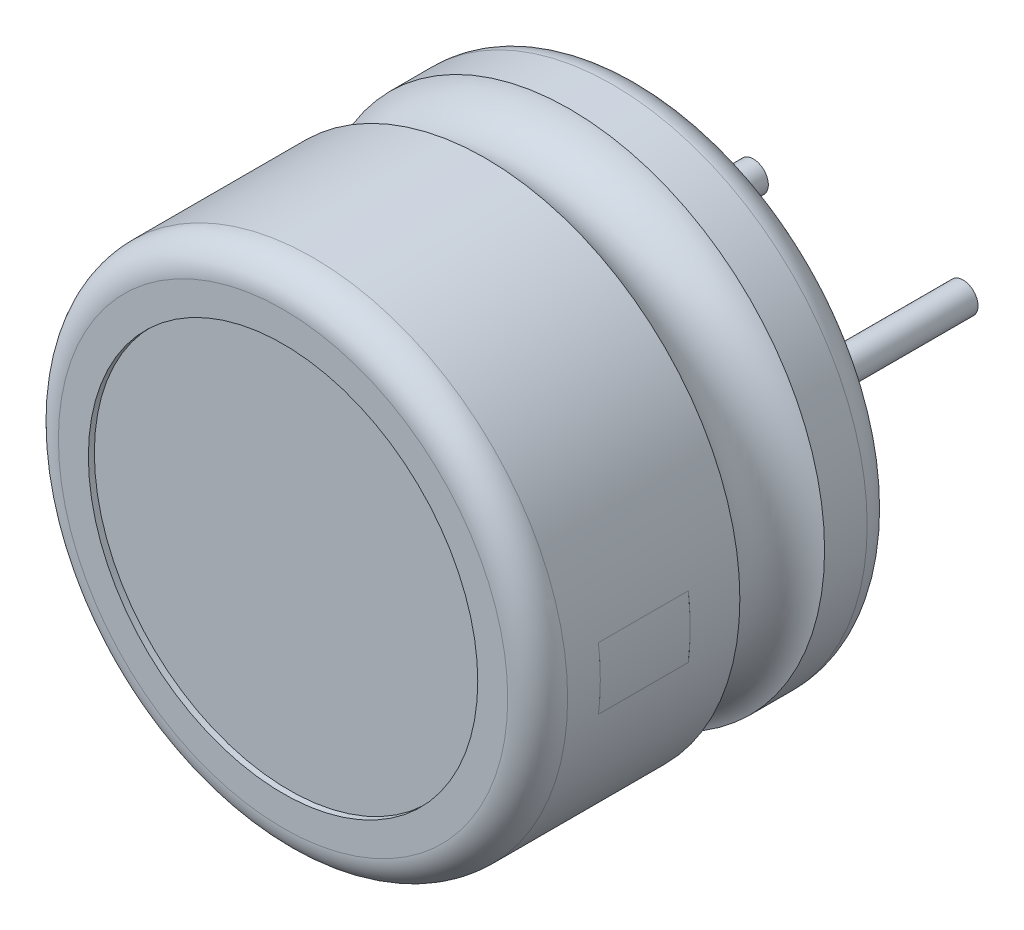
ISO-10303-21;
HEADER;
FILE_DESCRIPTION(('STEP AP214'),'2;1');
FILE_NAME('part.step','',(''),(''),'','','');
FILE_SCHEMA(('AUTOMOTIVE_DESIGN { 1 0 10303 214 1 1 1 1 }'));
ENDSEC;
DATA;
#1=APPLICATION_CONTEXT('core data for automotive mechanical design processes');
#2=APPLICATION_PROTOCOL_DEFINITION('international standard','automotive_design',2000,#1);
#3=PRODUCT_CONTEXT('',#1,'mechanical');
#4=PRODUCT('Part','Part','',(#3));
#5=PRODUCT_RELATED_PRODUCT_CATEGORY('part','',(#4));
#6=PRODUCT_DEFINITION_FORMATION('','',#4);
#7=PRODUCT_DEFINITION_CONTEXT('part definition',#1,'design');
#8=PRODUCT_DEFINITION('design','',#6,#7);
#9=PRODUCT_DEFINITION_SHAPE('','',#8);
#10=(LENGTH_UNIT() NAMED_UNIT(*) SI_UNIT(.MILLI.,.METRE.));
#11=(NAMED_UNIT(*) PLANE_ANGLE_UNIT() SI_UNIT($,.RADIAN.));
#12=(NAMED_UNIT(*) SI_UNIT($,.STERADIAN.) SOLID_ANGLE_UNIT());
#13=UNCERTAINTY_MEASURE_WITH_UNIT(LENGTH_MEASURE(1.E-05),#10,'distance_accuracy_value','');
#14=(GEOMETRIC_REPRESENTATION_CONTEXT(3) GLOBAL_UNCERTAINTY_ASSIGNED_CONTEXT((#13)) GLOBAL_UNIT_ASSIGNED_CONTEXT((#10,
#11,#12)) REPRESENTATION_CONTEXT('',''));
#15=CARTESIAN_POINT('',(0.,0.,0.));
#16=DIRECTION('',(0.,0.,1.));
#17=DIRECTION('',(1.,0.,0.));
#18=AXIS2_PLACEMENT_3D('',#15,#16,#17);
#19=CARTESIAN_POINT('',(0.,0.,0.2));
#20=DIRECTION('',(0.,0.,1.));
#21=DIRECTION('',(1.,0.,0.));
#22=AXIS2_PLACEMENT_3D('',#19,#20,#21);
#23=PLANE('',#22);
#24=CARTESIAN_POINT('',(0.,0.,0.2));
#25=DIRECTION('',(0.,0.,1.));
#26=DIRECTION('',(1.,0.,0.));
#27=AXIS2_PLACEMENT_3D('',#24,#25,#26);
#28=CIRCLE('',#27,3.25);
#29=CARTESIAN_POINT('',(3.25,0.,0.2));
#30=VERTEX_POINT('',#29);
#31=EDGE_CURVE('P0_E161',#30,#30,#28,.F.);
#32=ORIENTED_EDGE('',*,*,#31,.T.);
#33=EDGE_LOOP('',(#32));
#34=FACE_BOUND('',#33,.T.);
#35=ADVANCED_FACE('P0_F24',(#34),#23,.F.);
#36=CARTESIAN_POINT('',(0.,0.,0.));
#37=DIRECTION('',(0.,0.,1.));
#38=DIRECTION('',(1.,0.,0.));
#39=AXIS2_PLACEMENT_3D('',#36,#37,#38);
#40=CYLINDRICAL_SURFACE('',#39,3.25);
#41=ORIENTED_EDGE('',*,*,#31,.F.);
#42=EDGE_LOOP('',(#41));
#43=FACE_BOUND('',#42,.T.);
#44=CARTESIAN_POINT('',(0.,0.,0.));
#45=DIRECTION('',(0.,0.,1.));
#46=DIRECTION('',(1.,0.,0.));
#47=AXIS2_PLACEMENT_3D('',#44,#45,#46);
#48=CIRCLE('',#47,3.25);
#49=CARTESIAN_POINT('',(3.25,0.,0.));
#50=VERTEX_POINT('',#49);
#51=EDGE_CURVE('P0_E158',#50,#50,#48,.F.);
#52=ORIENTED_EDGE('',*,*,#51,.T.);
#53=EDGE_LOOP('',(#52));
#54=FACE_BOUND('',#53,.T.);
#55=ADVANCED_FACE('P0_F174',(#43,#54),#40,.F.);
#56=CARTESIAN_POINT('',(0.,0.,0.));
#57=DIRECTION('',(0.,0.,1.));
#58=DIRECTION('',(1.,0.,0.));
#59=AXIS2_PLACEMENT_3D('',#56,#57,#58);
#60=PLANE('',#59);
#61=ORIENTED_EDGE('',*,*,#51,.F.);
#62=EDGE_LOOP('',(#61));
#63=FACE_BOUND('',#62,.T.);
#64=CARTESIAN_POINT('',(0.,0.,0.));
#65=DIRECTION('',(0.,0.,1.));
#66=DIRECTION('',(-1.,0.,0.));
#67=AXIS2_PLACEMENT_3D('',#64,#65,#66);
#68=CIRCLE('',#67,3.75);
#69=CARTESIAN_POINT('',(-3.75,0.,0.));
#70=VERTEX_POINT('',#69);
#71=CARTESIAN_POINT('',(3.75,0.,0.));
#72=VERTEX_POINT('',#71);
#73=EDGE_CURVE('P0_E82',#70,#72,#68,.T.);
#74=ORIENTED_EDGE('',*,*,#73,.F.);
#75=CARTESIAN_POINT('',(0.,0.,0.));
#76=DIRECTION('',(0.,0.,1.));
#77=DIRECTION('',(1.,0.,0.));
#78=AXIS2_PLACEMENT_3D('',#75,#76,#77);
#79=CIRCLE('',#78,3.75);
#80=EDGE_CURVE('P0_E237',#72,#70,#79,.T.);
#81=ORIENTED_EDGE('',*,*,#80,.F.);
#82=EDGE_LOOP('',(#74,#81));
#83=FACE_BOUND('',#82,.T.);
#84=ADVANCED_FACE('P0_F177',(#63,#83),#60,.F.);
#85=CARTESIAN_POINT('',(0.,0.,0.5));
#86=DIRECTION('',(0.,0.,1.));
#87=DIRECTION('',(1.,0.,0.));
#88=AXIS2_PLACEMENT_3D('',#85,#86,#87);
#89=TOROIDAL_SURFACE('',#88,3.75,0.5);
#90=ORIENTED_EDGE('',*,*,#73,.T.);
#91=ORIENTED_EDGE('',*,*,#80,.T.);
#92=EDGE_LOOP('',(#90,#91));
#93=FACE_BOUND('',#92,.T.);
#94=CARTESIAN_POINT('',(0.,0.,0.5));
#95=DIRECTION('',(0.,0.,1.));
#96=DIRECTION('',(1.,0.,0.));
#97=AXIS2_PLACEMENT_3D('',#94,#95,#96);
#98=CIRCLE('',#97,4.25);
#99=CARTESIAN_POINT('',(4.25,0.,0.5));
#100=VERTEX_POINT('',#99);
#101=EDGE_CURVE('P0_E157',#100,#100,#98,.T.);
#102=ORIENTED_EDGE('',*,*,#101,.F.);
#103=EDGE_LOOP('',(#102));
#104=FACE_BOUND('',#103,.T.);
#105=ADVANCED_FACE('P0_F181',(#93,#104),#89,.T.);
#106=CARTESIAN_POINT('',(0.,0.,5.8));
#107=DIRECTION('',(0.,0.,1.));
#108=DIRECTION('',(1.,0.,0.));
#109=AXIS2_PLACEMENT_3D('',#106,#107,#108);
#110=PLANE('',#109);
#111=CARTESIAN_POINT('',(0.,0.,5.8));
#112=DIRECTION('',(0.,0.,1.));
#113=DIRECTION('',(1.,0.,0.));
#114=AXIS2_PLACEMENT_3D('',#111,#112,#113);
#115=CIRCLE('',#114,3.25);
#116=CARTESIAN_POINT('',(3.25,0.,5.8));
#117=VERTEX_POINT('',#116);
#118=EDGE_CURVE('P0_E153',#117,#117,#115,.T.);
#119=ORIENTED_EDGE('',*,*,#118,.T.);
#120=EDGE_LOOP('',(#119));
#121=FACE_BOUND('',#120,.T.);
#122=ADVANCED_FACE('P0_F187',(#121),#110,.T.);
#123=CARTESIAN_POINT('',(0.,0.,0.));
#124=DIRECTION('',(0.,0.,1.));
#125=DIRECTION('',(1.,0.,0.));
#126=AXIS2_PLACEMENT_3D('',#123,#124,#125);
#127=CYLINDRICAL_SURFACE('',#126,4.25);
#128=ORIENTED_EDGE('',*,*,#101,.T.);
#129=EDGE_LOOP('',(#128));
#130=FACE_BOUND('',#129,.T.);
#131=CARTESIAN_POINT('',(0.,0.,1.21101965064151));
#132=DIRECTION('',(0.,0.,1.));
#133=DIRECTION('',(1.,0.,0.));
#134=AXIS2_PLACEMENT_3D('',#131,#132,#133);
#135=CIRCLE('',#134,4.24999999999983);
#136=CARTESIAN_POINT('',(4.24999999999983,0.,1.21101965064151));
#137=VERTEX_POINT('',#136);
#138=EDGE_CURVE('P0_E156',#137,#137,#135,.F.);
#139=ORIENTED_EDGE('',*,*,#138,.T.);
#140=EDGE_LOOP('',(#139));
#141=FACE_BOUND('',#140,.T.);
#142=ADVANCED_FACE('P0_F248',(#130,#141),#127,.T.);
#143=CARTESIAN_POINT('',(0.,0.,5.8));
#144=DIRECTION('',(0.,0.,1.));
#145=DIRECTION('',(1.,0.,0.));
#146=AXIS2_PLACEMENT_3D('',#143,#144,#145);
#147=CYLINDRICAL_SURFACE('',#146,3.25);
#148=CARTESIAN_POINT('',(0.,0.,6.));
#149=DIRECTION('',(0.,0.,1.));
#150=DIRECTION('',(1.,0.,0.));
#151=AXIS2_PLACEMENT_3D('',#148,#149,#150);
#152=CIRCLE('',#151,3.25);
#153=CARTESIAN_POINT('',(3.25,0.,6.));
#154=VERTEX_POINT('',#153);
#155=EDGE_CURVE('P0_E98',#154,#154,#152,.F.);
#156=ORIENTED_EDGE('',*,*,#155,.F.);
#157=EDGE_LOOP('',(#156));
#158=FACE_BOUND('',#157,.T.);
#159=ORIENTED_EDGE('',*,*,#118,.F.);
#160=EDGE_LOOP('',(#159));
#161=FACE_BOUND('',#160,.T.);
#162=ADVANCED_FACE('P0_F252',(#158,#161),#147,.F.);
#163=CARTESIAN_POINT('',(4.119066529311,-0.505757775131,4.954869534903));
#164=DIRECTION('',(-0.121869343405041,-0.992546151641335,0.));
#165=DIRECTION('',(0.992546151641335,-0.121869343405041,0.));
#166=AXIS2_PLACEMENT_3D('',#163,#164,#165);
#167=PLANE('',#166);
#168=DIRECTION('',(0.,0.,1.));
#169=VECTOR('',#168,1.);
#170=CARTESIAN_POINT('',(4.119066529311,-0.505757775131,4.954869534903));
#171=LINE('',#170,#169);
#172=CARTESIAN_POINT('',(4.11906652931126,-0.505757775131032,4.954869534903));
#173=VERTEX_POINT('',#172);
#174=CARTESIAN_POINT('',(4.11906652931126,-0.505757775131032,3.454869534903));
#175=VERTEX_POINT('',#174);
#176=EDGE_CURVE('P0_E257',#173,#175,#171,.F.);
#177=ORIENTED_EDGE('',*,*,#176,.F.);
#178=DIRECTION('',(0.992546151641335,-0.121869343405041,0.));
#179=VECTOR('',#178,1.);
#180=CARTESIAN_POINT('',(4.119066529311,-0.505757775131,4.954869534903));
#181=LINE('',#180,#179);
#182=CARTESIAN_POINT('',(4.21832114447563,-0.517944709471761,4.954869534903));
#183=VERTEX_POINT('',#182);
#184=EDGE_CURVE('P0_E256',#183,#173,#181,.F.);
#185=ORIENTED_EDGE('',*,*,#184,.F.);
#186=DIRECTION('',(0.,0.,1.));
#187=VECTOR('',#186,1.);
#188=CARTESIAN_POINT('',(4.21832114447561,-0.517944709471954,0.));
#189=LINE('',#188,#187);
#190=CARTESIAN_POINT('',(4.21832114447563,-0.517944709471761,3.454869534903));
#191=VERTEX_POINT('',#190);
#192=EDGE_CURVE('P0_E104',#191,#183,#189,.T.);
#193=ORIENTED_EDGE('',*,*,#192,.F.);
#194=DIRECTION('',(0.992546151641335,-0.121869343405041,0.));
#195=VECTOR('',#194,1.);
#196=CARTESIAN_POINT('',(4.119066529311,-0.505757775131,3.454869534903));
#197=LINE('',#196,#195);
#198=EDGE_CURVE('P0_E99',#175,#191,#197,.T.);
#199=ORIENTED_EDGE('',*,*,#198,.F.);
#200=EDGE_LOOP('',(#177,#185,#193,#199));
#201=FACE_BOUND('',#200,.T.);
#202=ADVANCED_FACE('P0_F263',(#201),#167,.F.);
#203=CARTESIAN_POINT('',(0.,0.,6.));
#204=DIRECTION('',(0.,0.,1.));
#205=DIRECTION('',(1.,0.,0.));
#206=AXIS2_PLACEMENT_3D('',#203,#204,#205);
#207=PLANE('',#206);
#208=ORIENTED_EDGE('',*,*,#155,.T.);
#209=EDGE_LOOP('',(#208));
#210=FACE_BOUND('',#209,.T.);
#211=CARTESIAN_POINT('',(0.,0.,6.));
#212=DIRECTION('',(0.,0.,-1.));
#213=DIRECTION('',(1.,0.,0.));
#214=AXIS2_PLACEMENT_3D('',#211,#212,#213);
#215=CIRCLE('',#214,3.75);
#216=CARTESIAN_POINT('',(-3.75,0.,6.));
#217=VERTEX_POINT('',#216);
#218=CARTESIAN_POINT('',(3.75,0.,6.));
#219=VERTEX_POINT('',#218);
#220=EDGE_CURVE('P0_E90',#217,#219,#215,.F.);
#221=ORIENTED_EDGE('',*,*,#220,.T.);
#222=CARTESIAN_POINT('',(0.,0.,6.));
#223=DIRECTION('',(0.,0.,-1.));
#224=DIRECTION('',(-1.,0.,0.));
#225=AXIS2_PLACEMENT_3D('',#222,#223,#224);
#226=CIRCLE('',#225,3.75);
#227=EDGE_CURVE('P0_E94',#217,#219,#226,.T.);
#228=ORIENTED_EDGE('',*,*,#227,.F.);
#229=EDGE_LOOP('',(#221,#228));
#230=FACE_BOUND('',#229,.T.);
#231=ADVANCED_FACE('P0_F93',(#210,#230),#207,.T.);
#232=CARTESIAN_POINT('',(0.,0.,4.954869534903));
#233=DIRECTION('',(0.,0.,-1.));
#234=DIRECTION('',(-1.,0.,0.));
#235=AXIS2_PLACEMENT_3D('',#232,#233,#234);
#236=CYLINDRICAL_SURFACE('',#235,4.15);
#237=DIRECTION('',(0.,0.,1.));
#238=VECTOR('',#237,1.);
#239=CARTESIAN_POINT('',(4.11906652931095,0.505757775131384,4.954869534903));
#240=LINE('',#239,#238);
#241=CARTESIAN_POINT('',(4.11906652931123,0.505757775131224,3.454869534903));
#242=VERTEX_POINT('',#241);
#243=CARTESIAN_POINT('',(4.11906652931121,0.505757775131416,4.954869534903));
#244=VERTEX_POINT('',#243);
#245=EDGE_CURVE('P0_E142',#242,#244,#240,.T.);
#246=ORIENTED_EDGE('',*,*,#245,.T.);
#247=CARTESIAN_POINT('',(0.,0.,4.954869534903));
#248=DIRECTION('',(0.,0.,-1.));
#249=DIRECTION('',(-1.,0.,0.));
#250=AXIS2_PLACEMENT_3D('',#247,#248,#249);
#251=CIRCLE('',#250,4.15);
#252=EDGE_CURVE('P0_E75',#244,#173,#251,.T.);
#253=ORIENTED_EDGE('',*,*,#252,.T.);
#254=ORIENTED_EDGE('',*,*,#176,.T.);
#255=CARTESIAN_POINT('',(0.,0.,3.454869534903));
#256=DIRECTION('',(0.,0.,-1.));
#257=DIRECTION('',(-1.,0.,0.));
#258=AXIS2_PLACEMENT_3D('',#255,#256,#257);
#259=CIRCLE('',#258,4.15);
#260=EDGE_CURVE('P0_E68',#175,#242,#259,.F.);
#261=ORIENTED_EDGE('',*,*,#260,.T.);
#262=EDGE_LOOP('',(#246,#253,#254,#261));
#263=FACE_BOUND('',#262,.T.);
#264=ADVANCED_FACE('P0_F265',(#263),#236,.T.);
#265=CARTESIAN_POINT('',(0.,0.,1.918126431828));
#266=DIRECTION('',(0.,0.,1.));
#267=DIRECTION('',(1.,0.,0.));
#268=AXIS2_PLACEMENT_3D('',#265,#266,#267);
#269=TOROIDAL_SURFACE('',#268,4.5,0.75);
#270=ORIENTED_EDGE('',*,*,#138,.F.);
#271=EDGE_LOOP('',(#270));
#272=FACE_BOUND('',#271,.T.);
#273=CARTESIAN_POINT('',(0.,0.,2.625233213015));
#274=DIRECTION('',(0.,0.,1.));
#275=DIRECTION('',(1.,0.,0.));
#276=AXIS2_PLACEMENT_3D('',#273,#274,#275);
#277=CIRCLE('',#276,4.25);
#278=CARTESIAN_POINT('',(4.25,0.,2.625233213015));
#279=VERTEX_POINT('',#278);
#280=EDGE_CURVE('P0_E139',#279,#279,#277,.T.);
#281=ORIENTED_EDGE('',*,*,#280,.F.);
#282=EDGE_LOOP('',(#281));
#283=FACE_BOUND('',#282,.T.);
#284=ADVANCED_FACE('P0_F127',(#272,#283),#269,.F.);
#285=CARTESIAN_POINT('',(0.,0.,5.5));
#286=DIRECTION('',(0.,0.,-1.));
#287=DIRECTION('',(-1.,0.,0.));
#288=AXIS2_PLACEMENT_3D('',#285,#286,#287);
#289=TOROIDAL_SURFACE('',#288,3.75,0.5);
#290=CARTESIAN_POINT('',(0.,0.,5.5));
#291=DIRECTION('',(0.,0.,1.));
#292=DIRECTION('',(1.,0.,0.));
#293=AXIS2_PLACEMENT_3D('',#290,#291,#292);
#294=CIRCLE('',#293,4.25);
#295=CARTESIAN_POINT('',(4.25,0.,5.5));
#296=VERTEX_POINT('',#295);
#297=EDGE_CURVE('P0_E114',#296,#296,#294,.F.);
#298=ORIENTED_EDGE('',*,*,#297,.F.);
#299=EDGE_LOOP('',(#298));
#300=FACE_BOUND('',#299,.T.);
#301=ORIENTED_EDGE('',*,*,#227,.T.);
#302=ORIENTED_EDGE('',*,*,#220,.F.);
#303=EDGE_LOOP('',(#301,#302));
#304=FACE_BOUND('',#303,.T.);
#305=ADVANCED_FACE('P0_F103',(#300,#304),#289,.T.);
#306=CARTESIAN_POINT('',(4.186346410528,0.,4.954869534903));
#307=DIRECTION('',(0.,0.,1.));
#308=DIRECTION('',(1.,0.,0.));
#309=AXIS2_PLACEMENT_3D('',#306,#307,#308);
#310=PLANE('',#309);
#311=DIRECTION('',(-0.992546151641335,-0.121869343405041,0.));
#312=VECTOR('',#311,1.);
#313=CARTESIAN_POINT('',(4.218321144476,0.517944709472,4.954869534903));
#314=LINE('',#313,#312);
#315=CARTESIAN_POINT('',(4.21832114447561,0.517944709471952,4.954869534903));
#316=VERTEX_POINT('',#315);
#317=EDGE_CURVE('P0_E135',#244,#316,#314,.F.);
#318=ORIENTED_EDGE('',*,*,#317,.T.);
#319=CARTESIAN_POINT('',(0.,0.,4.954869534903));
#320=DIRECTION('',(0.,0.,1.));
#321=DIRECTION('',(1.,0.,0.));
#322=AXIS2_PLACEMENT_3D('',#319,#320,#321);
#323=CIRCLE('',#322,4.25);
#324=EDGE_CURVE('P0_E208',#183,#316,#323,.T.);
#325=ORIENTED_EDGE('',*,*,#324,.F.);
#326=ORIENTED_EDGE('',*,*,#184,.T.);
#327=ORIENTED_EDGE('',*,*,#252,.F.);
#328=EDGE_LOOP('',(#318,#325,#326,#327));
#329=FACE_BOUND('',#328,.T.);
#330=ADVANCED_FACE('P0_F126',(#329),#310,.F.);
#331=CARTESIAN_POINT('',(4.218321144476,0.517944709472,4.954869534903));
#332=DIRECTION('',(-0.121869343405041,0.992546151641335,0.));
#333=DIRECTION('',(-0.992546151641335,-0.121869343405041,0.));
#334=AXIS2_PLACEMENT_3D('',#331,#332,#333);
#335=PLANE('',#334);
#336=DIRECTION('',(0.,0.,1.));
#337=VECTOR('',#336,1.);
#338=CARTESIAN_POINT('',(4.21832114447561,0.517944709471952,0.));
#339=LINE('',#338,#337);
#340=CARTESIAN_POINT('',(4.21832114447561,0.517944709471952,3.454869534903));
#341=VERTEX_POINT('',#340);
#342=EDGE_CURVE('P0_E35',#316,#341,#339,.F.);
#343=ORIENTED_EDGE('',*,*,#342,.F.);
#344=ORIENTED_EDGE('',*,*,#317,.F.);
#345=ORIENTED_EDGE('',*,*,#245,.F.);
#346=DIRECTION('',(-0.992546151640864,-0.121869343408879,0.));
#347=VECTOR('',#346,1.);
#348=CARTESIAN_POINT('',(4.218321144476,0.517944709472,3.454869534903));
#349=LINE('',#348,#347);
#350=EDGE_CURVE('P0_E44',#341,#242,#349,.T.);
#351=ORIENTED_EDGE('',*,*,#350,.F.);
#352=EDGE_LOOP('',(#343,#344,#345,#351));
#353=FACE_BOUND('',#352,.T.);
#354=ADVANCED_FACE('P0_F197',(#353),#335,.F.);
#355=CARTESIAN_POINT('',(4.186346410528,0.,3.454869534903));
#356=DIRECTION('',(0.,0.,1.));
#357=DIRECTION('',(1.,0.,0.));
#358=AXIS2_PLACEMENT_3D('',#355,#356,#357);
#359=PLANE('',#358);
#360=ORIENTED_EDGE('',*,*,#260,.F.);
#361=ORIENTED_EDGE('',*,*,#198,.T.);
#362=CARTESIAN_POINT('',(0.,0.,3.454869534903));
#363=DIRECTION('',(0.,0.,1.));
#364=DIRECTION('',(1.,0.,0.));
#365=AXIS2_PLACEMENT_3D('',#362,#363,#364);
#366=CIRCLE('',#365,4.25);
#367=EDGE_CURVE('P0_E13',#341,#191,#366,.F.);
#368=ORIENTED_EDGE('',*,*,#367,.F.);
#369=ORIENTED_EDGE('',*,*,#350,.T.);
#370=EDGE_LOOP('',(#360,#361,#368,#369));
#371=FACE_BOUND('',#370,.T.);
#372=ADVANCED_FACE('P0_F191',(#371),#359,.T.);
#373=CARTESIAN_POINT('',(0.,0.,0.));
#374=DIRECTION('',(0.,0.,1.));
#375=DIRECTION('',(1.,0.,0.));
#376=AXIS2_PLACEMENT_3D('',#373,#374,#375);
#377=CYLINDRICAL_SURFACE('',#376,4.25);
#378=ORIENTED_EDGE('',*,*,#297,.T.);
#379=EDGE_LOOP('',(#378));
#380=FACE_BOUND('',#379,.T.);
#381=ORIENTED_EDGE('',*,*,#280,.T.);
#382=EDGE_LOOP('',(#381));
#383=FACE_BOUND('',#382,.T.);
#384=ORIENTED_EDGE('',*,*,#342,.T.);
#385=ORIENTED_EDGE('',*,*,#367,.T.);
#386=ORIENTED_EDGE('',*,*,#192,.T.);
#387=ORIENTED_EDGE('',*,*,#324,.T.);
#388=EDGE_LOOP('',(#384,#385,#386,#387));
#389=FACE_BOUND('',#388,.T.);
#390=ADVANCED_FACE('P0_F189',(#380,#383,#389),#377,.T.);
#391=CLOSED_SHELL('',(#35,#55,#84,#105,#122,#142,#162,#202,#231,#264,#284,#305,#330,#354,#372,#390));
#392=MANIFOLD_SOLID_BREP('P0_B1',#391);
#393=CARTESIAN_POINT('',(0.,0.,0.2));
#394=DIRECTION('',(0.,0.,1.));
#395=DIRECTION('',(1.,0.,0.));
#396=AXIS2_PLACEMENT_3D('',#393,#394,#395);
#397=PLANE('',#396);
#398=CARTESIAN_POINT('',(0.,0.,0.2));
#399=DIRECTION('',(0.,0.,-1.));
#400=DIRECTION('',(-1.,0.,0.));
#401=AXIS2_PLACEMENT_3D('',#398,#399,#400);
#402=CIRCLE('',#401,3.25);
#403=CARTESIAN_POINT('',(-3.25,0.,0.2));
#404=VERTEX_POINT('',#403);
#405=EDGE_CURVE('P1_E17',#404,#404,#402,.T.);
#406=ORIENTED_EDGE('',*,*,#405,.F.);
#407=EDGE_LOOP('',(#406));
#408=FACE_BOUND('',#407,.T.);
#409=ADVANCED_FACE('P1_F14',(#408),#397,.T.);
#410=CARTESIAN_POINT('',(0.,0.,0.2));
#411=DIRECTION('',(0.,0.,-1.));
#412=DIRECTION('',(-1.,0.,0.));
#413=AXIS2_PLACEMENT_3D('',#410,#411,#412);
#414=CYLINDRICAL_SURFACE('',#413,3.25);
#415=CARTESIAN_POINT('',(0.,0.,0.1));
#416=DIRECTION('',(0.,0.,-1.));
#417=DIRECTION('',(-1.,0.,0.));
#418=AXIS2_PLACEMENT_3D('',#415,#416,#417);
#419=CIRCLE('',#418,3.25);
#420=CARTESIAN_POINT('',(-3.25,0.,0.1));
#421=VERTEX_POINT('',#420);
#422=EDGE_CURVE('P1_E10',#421,#421,#419,.F.);
#423=ORIENTED_EDGE('',*,*,#422,.T.);
#424=EDGE_LOOP('',(#423));
#425=FACE_BOUND('',#424,.T.);
#426=ORIENTED_EDGE('',*,*,#405,.T.);
#427=EDGE_LOOP('',(#426));
#428=FACE_BOUND('',#427,.T.);
#429=ADVANCED_FACE('P1_F26',(#425,#428),#414,.T.);
#430=CARTESIAN_POINT('',(0.,0.,0.1));
#431=DIRECTION('',(0.,0.,1.));
#432=DIRECTION('',(1.,0.,0.));
#433=AXIS2_PLACEMENT_3D('',#430,#431,#432);
#434=PLANE('',#433);
#435=ORIENTED_EDGE('',*,*,#422,.F.);
#436=EDGE_LOOP('',(#435));
#437=FACE_BOUND('',#436,.T.);
#438=ADVANCED_FACE('P1_F33',(#437),#434,.F.);
#439=CLOSED_SHELL('',(#409,#429,#438));
#440=MANIFOLD_SOLID_BREP('P1_B1',#439);
#441=CARTESIAN_POINT('',(1.75,0.,0.));
#442=DIRECTION('',(0.,0.,1.));
#443=DIRECTION('',(1.,0.,0.));
#444=AXIS2_PLACEMENT_3D('',#441,#442,#443);
#445=PLANE('',#444);
#446=CARTESIAN_POINT('',(1.75,0.,0.));
#447=DIRECTION('',(0.,0.,-1.));
#448=DIRECTION('',(-1.,0.,0.));
#449=AXIS2_PLACEMENT_3D('',#446,#447,#448);
#450=CIRCLE('',#449,0.25);
#451=CARTESIAN_POINT('',(1.5,0.,0.));
#452=VERTEX_POINT('',#451);
#453=EDGE_CURVE('P2_E17',#452,#452,#450,.T.);
#454=ORIENTED_EDGE('',*,*,#453,.F.);
#455=EDGE_LOOP('',(#454));
#456=FACE_BOUND('',#455,.T.);
#457=ADVANCED_FACE('P2_F14',(#456),#445,.T.);
#458=CARTESIAN_POINT('',(1.75,0.,-3.6));
#459=DIRECTION('',(0.,0.,1.));
#460=DIRECTION('',(1.,0.,0.));
#461=AXIS2_PLACEMENT_3D('',#458,#459,#460);
#462=PLANE('',#461);
#463=CARTESIAN_POINT('',(1.75,0.,-3.6));
#464=DIRECTION('',(0.,0.,-1.));
#465=DIRECTION('',(-1.,0.,0.));
#466=AXIS2_PLACEMENT_3D('',#463,#464,#465);
#467=CIRCLE('',#466,0.25);
#468=CARTESIAN_POINT('',(1.5,0.,-3.6));
#469=VERTEX_POINT('',#468);
#470=EDGE_CURVE('P2_E10',#469,#469,#467,.F.);
#471=ORIENTED_EDGE('',*,*,#470,.F.);
#472=EDGE_LOOP('',(#471));
#473=FACE_BOUND('',#472,.T.);
#474=ADVANCED_FACE('P2_F29',(#473),#462,.F.);
#475=CARTESIAN_POINT('',(1.75,0.,0.));
#476=DIRECTION('',(0.,0.,-1.));
#477=DIRECTION('',(-1.,0.,0.));
#478=AXIS2_PLACEMENT_3D('',#475,#476,#477);
#479=CYLINDRICAL_SURFACE('',#478,0.25);
#480=ORIENTED_EDGE('',*,*,#453,.T.);
#481=EDGE_LOOP('',(#480));
#482=FACE_BOUND('',#481,.T.);
#483=ORIENTED_EDGE('',*,*,#470,.T.);
#484=EDGE_LOOP('',(#483));
#485=FACE_BOUND('',#484,.T.);
#486=ADVANCED_FACE('P2_F26',(#482,#485),#479,.T.);
#487=CLOSED_SHELL('',(#457,#474,#486));
#488=MANIFOLD_SOLID_BREP('P2_B1',#487);
#489=CARTESIAN_POINT('',(4.119066529311,-0.505757775131,4.954869534903));
#490=DIRECTION('',(-0.121869343405041,-0.992546151641335,0.));
#491=DIRECTION('',(0.992546151641335,-0.121869343405041,0.));
#492=AXIS2_PLACEMENT_3D('',#489,#490,#491);
#493=PLANE('',#492);
#494=DIRECTION('',(0.992546151641335,-0.121869343405041,0.));
#495=VECTOR('',#494,1.);
#496=CARTESIAN_POINT('',(4.119066529311,-0.505757775131,4.954869534903));
#497=LINE('',#496,#495);
#498=CARTESIAN_POINT('',(4.21832114447565,-0.517944709471762,4.954869534903));
#499=VERTEX_POINT('',#498);
#500=CARTESIAN_POINT('',(4.11906652931126,-0.505757775131032,4.954869534903));
#501=VERTEX_POINT('',#500);
#502=EDGE_CURVE('P3_E61',#499,#501,#497,.F.);
#503=ORIENTED_EDGE('',*,*,#502,.T.);
#504=DIRECTION('',(0.,0.,1.));
#505=VECTOR('',#504,1.);
#506=CARTESIAN_POINT('',(4.119066529311,-0.505757775131,4.954869534903));
#507=LINE('',#506,#505);
#508=CARTESIAN_POINT('',(4.11906652931126,-0.505757775131032,3.454869534903));
#509=VERTEX_POINT('',#508);
#510=EDGE_CURVE('P3_E64',#501,#509,#507,.F.);
#511=ORIENTED_EDGE('',*,*,#510,.T.);
#512=DIRECTION('',(0.992546151641335,-0.121869343405041,0.));
#513=VECTOR('',#512,1.);
#514=CARTESIAN_POINT('',(4.119066529311,-0.505757775131,3.454869534903));
#515=LINE('',#514,#513);
#516=CARTESIAN_POINT('',(4.21832114447565,-0.517944709471762,3.454869534903));
#517=VERTEX_POINT('',#516);
#518=EDGE_CURVE('P3_E71',#509,#517,#515,.T.);
#519=ORIENTED_EDGE('',*,*,#518,.T.);
#520=DIRECTION('',(0.,0.,-1.));
#521=VECTOR('',#520,1.);
#522=CARTESIAN_POINT('',(4.21832114447562,-0.517944709471953,4.954869534903));
#523=LINE('',#522,#521);
#524=EDGE_CURVE('P3_E63',#499,#517,#523,.T.);
#525=ORIENTED_EDGE('',*,*,#524,.F.);
#526=EDGE_LOOP('',(#503,#511,#519,#525));
#527=FACE_BOUND('',#526,.T.);
#528=ADVANCED_FACE('P3_F16',(#527),#493,.T.);
#529=CARTESIAN_POINT('',(0.,0.,4.954869534903));
#530=DIRECTION('',(0.,0.,-1.));
#531=DIRECTION('',(-1.,0.,0.));
#532=AXIS2_PLACEMENT_3D('',#529,#530,#531);
#533=CYLINDRICAL_SURFACE('',#532,4.15);
#534=CARTESIAN_POINT('',(0.,0.,4.954869534903));
#535=DIRECTION('',(0.,0.,-1.));
#536=DIRECTION('',(-1.,0.,0.));
#537=AXIS2_PLACEMENT_3D('',#534,#535,#536);
#538=CIRCLE('',#537,4.15);
#539=CARTESIAN_POINT('',(4.11906652931123,0.505757775131224,4.954869534903));
#540=VERTEX_POINT('',#539);
#541=EDGE_CURVE('P3_E19',#540,#501,#538,.T.);
#542=ORIENTED_EDGE('',*,*,#541,.F.);
#543=DIRECTION('',(0.,0.,1.));
#544=VECTOR('',#543,1.);
#545=CARTESIAN_POINT('',(4.11906652931095,0.505757775131384,4.954869534903));
#546=LINE('',#545,#544);
#547=CARTESIAN_POINT('',(4.11906652931121,0.505757775131416,3.454869534903));
#548=VERTEX_POINT('',#547);
#549=EDGE_CURVE('P3_E81',#548,#540,#546,.T.);
#550=ORIENTED_EDGE('',*,*,#549,.F.);
#551=CARTESIAN_POINT('',(0.,0.,3.454869534903));
#552=DIRECTION('',(0.,0.,-1.));
#553=DIRECTION('',(-1.,0.,0.));
#554=AXIS2_PLACEMENT_3D('',#551,#552,#553);
#555=CIRCLE('',#554,4.15);
#556=EDGE_CURVE('P3_E54',#548,#509,#555,.T.);
#557=ORIENTED_EDGE('',*,*,#556,.T.);
#558=ORIENTED_EDGE('',*,*,#510,.F.);
#559=EDGE_LOOP('',(#542,#550,#557,#558));
#560=FACE_BOUND('',#559,.T.);
#561=ADVANCED_FACE('P3_F66',(#560),#533,.F.);
#562=CARTESIAN_POINT('',(4.186346410528,0.,3.454869534903));
#563=DIRECTION('',(0.,0.,1.));
#564=DIRECTION('',(1.,0.,0.));
#565=AXIS2_PLACEMENT_3D('',#562,#563,#564);
#566=PLANE('',#565);
#567=ORIENTED_EDGE('',*,*,#518,.F.);
#568=ORIENTED_EDGE('',*,*,#556,.F.);
#569=DIRECTION('',(-0.992546151641335,-0.121869343405041,0.));
#570=VECTOR('',#569,1.);
#571=CARTESIAN_POINT('',(4.218321144476,0.517944709472,3.454869534903));
#572=LINE('',#571,#570);
#573=CARTESIAN_POINT('',(4.21832114447562,0.517944709471954,3.454869534903));
#574=VERTEX_POINT('',#573);
#575=EDGE_CURVE('P3_E79',#574,#548,#572,.T.);
#576=ORIENTED_EDGE('',*,*,#575,.F.);
#577=CARTESIAN_POINT('',(0.,0.,3.454869534903));
#578=DIRECTION('',(0.,0.,-1.));
#579=DIRECTION('',(-1.,0.,0.));
#580=AXIS2_PLACEMENT_3D('',#577,#578,#579);
#581=CIRCLE('',#580,4.25);
#582=EDGE_CURVE('P3_E77',#517,#574,#581,.F.);
#583=ORIENTED_EDGE('',*,*,#582,.F.);
#584=EDGE_LOOP('',(#567,#568,#576,#583));
#585=FACE_BOUND('',#584,.T.);
#586=ADVANCED_FACE('P3_F90',(#585),#566,.F.);
#587=CARTESIAN_POINT('',(4.218321144476,0.517944709472,4.954869534903));
#588=DIRECTION('',(-0.121869343405041,0.992546151641335,0.));
#589=DIRECTION('',(-0.992546151641335,-0.121869343405041,0.));
#590=AXIS2_PLACEMENT_3D('',#587,#588,#589);
#591=PLANE('',#590);
#592=DIRECTION('',(-0.992546151640864,-0.121869343408879,0.));
#593=VECTOR('',#592,1.);
#594=CARTESIAN_POINT('',(4.218321144476,0.517944709472,4.954869534903));
#595=LINE('',#594,#593);
#596=CARTESIAN_POINT('',(4.21832114447562,0.517944709471954,4.954869534903));
#597=VERTEX_POINT('',#596);
#598=EDGE_CURVE('P3_E34',#597,#540,#595,.T.);
#599=ORIENTED_EDGE('',*,*,#598,.F.);
#600=DIRECTION('',(0.,0.,-1.));
#601=VECTOR('',#600,1.);
#602=CARTESIAN_POINT('',(4.21832114447562,0.517944709471954,4.954869534903));
#603=LINE('',#602,#601);
#604=EDGE_CURVE('P3_E25',#574,#597,#603,.F.);
#605=ORIENTED_EDGE('',*,*,#604,.F.);
#606=ORIENTED_EDGE('',*,*,#575,.T.);
#607=ORIENTED_EDGE('',*,*,#549,.T.);
#608=EDGE_LOOP('',(#599,#605,#606,#607));
#609=FACE_BOUND('',#608,.T.);
#610=ADVANCED_FACE('P3_F88',(#609),#591,.T.);
#611=CARTESIAN_POINT('',(4.186346410528,0.,4.954869534903));
#612=DIRECTION('',(0.,0.,1.));
#613=DIRECTION('',(1.,0.,0.));
#614=AXIS2_PLACEMENT_3D('',#611,#612,#613);
#615=PLANE('',#614);
#616=CARTESIAN_POINT('',(0.,0.,4.954869534903));
#617=DIRECTION('',(0.,0.,-1.));
#618=DIRECTION('',(-1.,0.,0.));
#619=AXIS2_PLACEMENT_3D('',#616,#617,#618);
#620=CIRCLE('',#619,4.25);
#621=EDGE_CURVE('P3_E11',#597,#499,#620,.T.);
#622=ORIENTED_EDGE('',*,*,#621,.F.);
#623=ORIENTED_EDGE('',*,*,#598,.T.);
#624=ORIENTED_EDGE('',*,*,#541,.T.);
#625=ORIENTED_EDGE('',*,*,#502,.F.);
#626=EDGE_LOOP('',(#622,#623,#624,#625));
#627=FACE_BOUND('',#626,.T.);
#628=ADVANCED_FACE('P3_F59',(#627),#615,.T.);
#629=CARTESIAN_POINT('',(0.,0.,4.954869534903));
#630=DIRECTION('',(0.,0.,-1.));
#631=DIRECTION('',(-1.,0.,0.));
#632=AXIS2_PLACEMENT_3D('',#629,#630,#631);
#633=CYLINDRICAL_SURFACE('',#632,4.25);
#634=ORIENTED_EDGE('',*,*,#604,.T.);
#635=ORIENTED_EDGE('',*,*,#621,.T.);
#636=ORIENTED_EDGE('',*,*,#524,.T.);
#637=ORIENTED_EDGE('',*,*,#582,.T.);
#638=EDGE_LOOP('',(#634,#635,#636,#637));
#639=FACE_BOUND('',#638,.T.);
#640=ADVANCED_FACE('P3_F85',(#639),#633,.T.);
#641=CLOSED_SHELL('',(#528,#561,#586,#610,#628,#640));
#642=MANIFOLD_SOLID_BREP('P3_B1',#641);
#643=CARTESIAN_POINT('',(-1.75,0.,0.));
#644=DIRECTION('',(0.,0.,1.));
#645=DIRECTION('',(1.,0.,0.));
#646=AXIS2_PLACEMENT_3D('',#643,#644,#645);
#647=PLANE('',#646);
#648=CARTESIAN_POINT('',(-1.75,0.,0.));
#649=DIRECTION('',(0.,0.,-1.));
#650=DIRECTION('',(-1.,0.,0.));
#651=AXIS2_PLACEMENT_3D('',#648,#649,#650);
#652=CIRCLE('',#651,0.25);
#653=CARTESIAN_POINT('',(-2.,0.,0.));
#654=VERTEX_POINT('',#653);
#655=EDGE_CURVE('P4_E17',#654,#654,#652,.T.);
#656=ORIENTED_EDGE('',*,*,#655,.F.);
#657=EDGE_LOOP('',(#656));
#658=FACE_BOUND('',#657,.T.);
#659=ADVANCED_FACE('P4_F14',(#658),#647,.T.);
#660=CARTESIAN_POINT('',(-1.75,0.,-3.6));
#661=DIRECTION('',(0.,0.,1.));
#662=DIRECTION('',(1.,0.,0.));
#663=AXIS2_PLACEMENT_3D('',#660,#661,#662);
#664=PLANE('',#663);
#665=CARTESIAN_POINT('',(-1.75,0.,-3.6));
#666=DIRECTION('',(0.,0.,-1.));
#667=DIRECTION('',(-1.,0.,0.));
#668=AXIS2_PLACEMENT_3D('',#665,#666,#667);
#669=CIRCLE('',#668,0.25);
#670=CARTESIAN_POINT('',(-2.,0.,-3.6));
#671=VERTEX_POINT('',#670);
#672=EDGE_CURVE('P4_E10',#671,#671,#669,.F.);
#673=ORIENTED_EDGE('',*,*,#672,.F.);
#674=EDGE_LOOP('',(#673));
#675=FACE_BOUND('',#674,.T.);
#676=ADVANCED_FACE('P4_F29',(#675),#664,.F.);
#677=CARTESIAN_POINT('',(-1.75,0.,0.));
#678=DIRECTION('',(0.,0.,-1.));
#679=DIRECTION('',(-1.,0.,0.));
#680=AXIS2_PLACEMENT_3D('',#677,#678,#679);
#681=CYLINDRICAL_SURFACE('',#680,0.25);
#682=ORIENTED_EDGE('',*,*,#655,.T.);
#683=EDGE_LOOP('',(#682));
#684=FACE_BOUND('',#683,.T.);
#685=ORIENTED_EDGE('',*,*,#672,.T.);
#686=EDGE_LOOP('',(#685));
#687=FACE_BOUND('',#686,.T.);
#688=ADVANCED_FACE('P4_F26',(#684,#687),#681,.T.);
#689=CLOSED_SHELL('',(#659,#676,#688));
#690=MANIFOLD_SOLID_BREP('P4_B1',#689);
#691=CARTESIAN_POINT('',(0.,0.,5.9));
#692=DIRECTION('',(0.,0.,1.));
#693=DIRECTION('',(1.,0.,0.));
#694=AXIS2_PLACEMENT_3D('',#691,#692,#693);
#695=PLANE('',#694);
#696=CARTESIAN_POINT('',(0.,0.,5.9));
#697=DIRECTION('',(0.,0.,1.));
#698=DIRECTION('',(1.,0.,0.));
#699=AXIS2_PLACEMENT_3D('',#696,#697,#698);
#700=CIRCLE('',#699,3.25);
#701=CARTESIAN_POINT('',(3.25,0.,5.9));
#702=VERTEX_POINT('',#701);
#703=EDGE_CURVE('P5_E17',#702,#702,#700,.F.);
#704=ORIENTED_EDGE('',*,*,#703,.F.);
#705=EDGE_LOOP('',(#704));
#706=FACE_BOUND('',#705,.T.);
#707=ADVANCED_FACE('P5_F14',(#706),#695,.T.);
#708=CARTESIAN_POINT('',(0.,0.,5.8));
#709=DIRECTION('',(0.,0.,1.));
#710=DIRECTION('',(1.,0.,0.));
#711=AXIS2_PLACEMENT_3D('',#708,#709,#710);
#712=CYLINDRICAL_SURFACE('',#711,3.25);
#713=CARTESIAN_POINT('',(0.,0.,5.8));
#714=DIRECTION('',(0.,0.,1.));
#715=DIRECTION('',(1.,0.,0.));
#716=AXIS2_PLACEMENT_3D('',#713,#714,#715);
#717=CIRCLE('',#716,3.25);
#718=CARTESIAN_POINT('',(3.25,0.,5.8));
#719=VERTEX_POINT('',#718);
#720=EDGE_CURVE('P5_E10',#719,#719,#717,.T.);
#721=ORIENTED_EDGE('',*,*,#720,.T.);
#722=EDGE_LOOP('',(#721));
#723=FACE_BOUND('',#722,.T.);
#724=ORIENTED_EDGE('',*,*,#703,.T.);
#725=EDGE_LOOP('',(#724));
#726=FACE_BOUND('',#725,.T.);
#727=ADVANCED_FACE('P5_F26',(#723,#726),#712,.T.);
#728=CARTESIAN_POINT('',(0.,0.,5.8));
#729=DIRECTION('',(0.,0.,1.));
#730=DIRECTION('',(1.,0.,0.));
#731=AXIS2_PLACEMENT_3D('',#728,#729,#730);
#732=PLANE('',#731);
#733=ORIENTED_EDGE('',*,*,#720,.F.);
#734=EDGE_LOOP('',(#733));
#735=FACE_BOUND('',#734,.T.);
#736=ADVANCED_FACE('P5_F33',(#735),#732,.F.);
#737=CLOSED_SHELL('',(#707,#727,#736));
#738=MANIFOLD_SOLID_BREP('P5_B1',#737);
#739=ADVANCED_BREP_SHAPE_REPRESENTATION('',(#18,#392,#440,#488,#642,#690,#738),#14);
#740=SHAPE_DEFINITION_REPRESENTATION(#9,#739);
ENDSEC;
END-ISO-10303-21;
